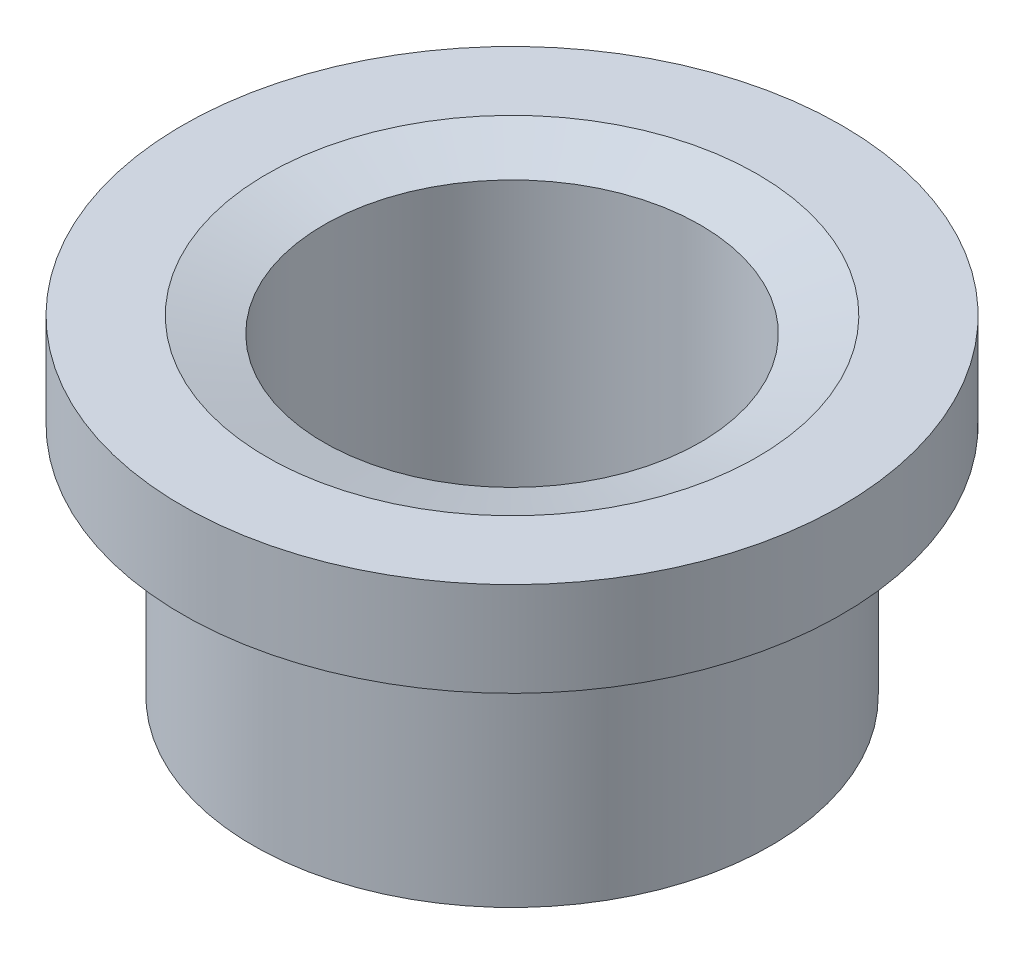
ISO-10303-21;
HEADER;
FILE_DESCRIPTION(('STEP AP214'),'2;1');
FILE_NAME('part.step','',(''),(''),'','','');
FILE_SCHEMA(('AUTOMOTIVE_DESIGN { 1 0 10303 214 1 1 1 1 }'));
ENDSEC;
DATA;
#1=APPLICATION_CONTEXT('core data for automotive mechanical design processes');
#2=APPLICATION_PROTOCOL_DEFINITION('international standard','automotive_design',2000,#1);
#3=PRODUCT_CONTEXT('',#1,'mechanical');
#4=PRODUCT('Part','Part','',(#3));
#5=PRODUCT_RELATED_PRODUCT_CATEGORY('part','',(#4));
#6=PRODUCT_DEFINITION_FORMATION('','',#4);
#7=PRODUCT_DEFINITION_CONTEXT('part definition',#1,'design');
#8=PRODUCT_DEFINITION('design','',#6,#7);
#9=PRODUCT_DEFINITION_SHAPE('','',#8);
#10=(LENGTH_UNIT() NAMED_UNIT(*) SI_UNIT(.MILLI.,.METRE.));
#11=(NAMED_UNIT(*) PLANE_ANGLE_UNIT() SI_UNIT($,.RADIAN.));
#12=(NAMED_UNIT(*) SI_UNIT($,.STERADIAN.) SOLID_ANGLE_UNIT());
#13=UNCERTAINTY_MEASURE_WITH_UNIT(LENGTH_MEASURE(1.E-05),#10,'distance_accuracy_value','');
#14=(GEOMETRIC_REPRESENTATION_CONTEXT(3) GLOBAL_UNCERTAINTY_ASSIGNED_CONTEXT((#13)) GLOBAL_UNIT_ASSIGNED_CONTEXT((#10,
#11,#12)) REPRESENTATION_CONTEXT('',''));
#15=CARTESIAN_POINT('',(0.,0.,0.));
#16=DIRECTION('',(0.,0.,1.));
#17=DIRECTION('',(1.,0.,0.));
#18=AXIS2_PLACEMENT_3D('',#15,#16,#17);
#19=CARTESIAN_POINT('',(0.,0.,0.));
#20=DIRECTION('',(0.,-1.,0.));
#21=DIRECTION('',(0.,0.,-1.));
#22=AXIS2_PLACEMENT_3D('',#19,#20,#21);
#23=CYLINDRICAL_SURFACE('',#22,16.5);
#24=CARTESIAN_POINT('',(0.,15.,0.));
#25=DIRECTION('',(0.,-1.,0.));
#26=DIRECTION('',(0.,0.,-1.));
#27=AXIS2_PLACEMENT_3D('',#24,#25,#26);
#28=CIRCLE('',#27,16.5);
#29=CARTESIAN_POINT('',(0.,15.,-16.5));
#30=VERTEX_POINT('',#29);
#31=EDGE_CURVE('E58',#30,#30,#28,.T.);
#32=ORIENTED_EDGE('',*,*,#31,.T.);
#33=EDGE_LOOP('',(#32));
#34=FACE_BOUND('',#33,.T.);
#35=CARTESIAN_POINT('',(0.,0.,0.));
#36=DIRECTION('',(0.,-1.,0.));
#37=DIRECTION('',(0.,0.,-1.));
#38=AXIS2_PLACEMENT_3D('',#35,#36,#37);
#39=CIRCLE('',#38,16.5);
#40=CARTESIAN_POINT('',(0.,0.,-16.5));
#41=VERTEX_POINT('',#40);
#42=EDGE_CURVE('E10',#41,#41,#39,.T.);
#43=ORIENTED_EDGE('',*,*,#42,.F.);
#44=EDGE_LOOP('',(#43));
#45=FACE_BOUND('',#44,.T.);
#46=ADVANCED_FACE('F33',(#34,#45),#23,.T.);
#47=CARTESIAN_POINT('',(12.,0.,0.));
#48=DIRECTION('',(0.,-1.,0.));
#49=DIRECTION('',(0.,0.,-1.));
#50=AXIS2_PLACEMENT_3D('',#47,#48,#49);
#51=PLANE('',#50);
#52=ORIENTED_EDGE('',*,*,#42,.T.);
#53=EDGE_LOOP('',(#52));
#54=FACE_BOUND('',#53,.T.);
#55=CARTESIAN_POINT('',(0.,0.,0.));
#56=DIRECTION('',(0.,-1.,0.));
#57=DIRECTION('',(0.,0.,-1.));
#58=AXIS2_PLACEMENT_3D('',#55,#56,#57);
#59=CIRCLE('',#58,12.);
#60=CARTESIAN_POINT('',(0.,0.,-12.));
#61=VERTEX_POINT('',#60);
#62=EDGE_CURVE('E39',#61,#61,#59,.T.);
#63=ORIENTED_EDGE('',*,*,#62,.F.);
#64=EDGE_LOOP('',(#63));
#65=FACE_BOUND('',#64,.T.);
#66=ADVANCED_FACE('F76',(#54,#65),#51,.T.);
#67=CARTESIAN_POINT('',(0.,0.,0.));
#68=DIRECTION('',(0.,-1.,0.));
#69=DIRECTION('',(0.,0.,-1.));
#70=AXIS2_PLACEMENT_3D('',#67,#68,#69);
#71=CYLINDRICAL_SURFACE('',#70,12.);
#72=ORIENTED_EDGE('',*,*,#62,.T.);
#73=EDGE_LOOP('',(#72));
#74=FACE_BOUND('',#73,.T.);
#75=CARTESIAN_POINT('',(0.,20.,0.));
#76=DIRECTION('',(0.,-1.,0.));
#77=DIRECTION('',(0.,0.,-1.));
#78=AXIS2_PLACEMENT_3D('',#75,#76,#77);
#79=CIRCLE('',#78,12.);
#80=CARTESIAN_POINT('',(0.,20.,-12.));
#81=VERTEX_POINT('',#80);
#82=EDGE_CURVE('E43',#81,#81,#79,.T.);
#83=ORIENTED_EDGE('',*,*,#82,.F.);
#84=EDGE_LOOP('',(#83));
#85=FACE_BOUND('',#84,.T.);
#86=ADVANCED_FACE('F80',(#74,#85),#71,.F.);
#87=CARTESIAN_POINT('',(0.,21.,0.));
#88=DIRECTION('',(0.,1.,0.));
#89=DIRECTION('',(0.,0.,1.));
#90=AXIS2_PLACEMENT_3D('',#87,#88,#89);
#91=CONICAL_SURFACE('',#90,15.625,1.3016288340092);
#92=ORIENTED_EDGE('',*,*,#82,.T.);
#93=EDGE_LOOP('',(#92));
#94=FACE_BOUND('',#93,.T.);
#95=CARTESIAN_POINT('',(0.,21.,0.));
#96=DIRECTION('',(0.,-1.,0.));
#97=DIRECTION('',(0.,0.,-1.));
#98=AXIS2_PLACEMENT_3D('',#95,#96,#97);
#99=CIRCLE('',#98,15.625);
#100=CARTESIAN_POINT('',(0.,21.,-15.625));
#101=VERTEX_POINT('',#100);
#102=EDGE_CURVE('E47',#101,#101,#99,.T.);
#103=ORIENTED_EDGE('',*,*,#102,.F.);
#104=EDGE_LOOP('',(#103));
#105=FACE_BOUND('',#104,.T.);
#106=ADVANCED_FACE('F84',(#94,#105),#91,.F.);
#107=CARTESIAN_POINT('',(21.,21.,0.));
#108=DIRECTION('',(0.,1.,0.));
#109=DIRECTION('',(0.,0.,1.));
#110=AXIS2_PLACEMENT_3D('',#107,#108,#109);
#111=PLANE('',#110);
#112=ORIENTED_EDGE('',*,*,#102,.T.);
#113=EDGE_LOOP('',(#112));
#114=FACE_BOUND('',#113,.T.);
#115=CARTESIAN_POINT('',(0.,21.,0.));
#116=DIRECTION('',(0.,-1.,0.));
#117=DIRECTION('',(0.,0.,-1.));
#118=AXIS2_PLACEMENT_3D('',#115,#116,#117);
#119=CIRCLE('',#118,21.);
#120=CARTESIAN_POINT('',(0.,21.,-21.));
#121=VERTEX_POINT('',#120);
#122=EDGE_CURVE('E52',#121,#121,#119,.T.);
#123=ORIENTED_EDGE('',*,*,#122,.F.);
#124=EDGE_LOOP('',(#123));
#125=FACE_BOUND('',#124,.T.);
#126=ADVANCED_FACE('F72',(#114,#125),#111,.T.);
#127=CARTESIAN_POINT('',(0.,0.,0.));
#128=DIRECTION('',(0.,-1.,0.));
#129=DIRECTION('',(0.,0.,-1.));
#130=AXIS2_PLACEMENT_3D('',#127,#128,#129);
#131=CYLINDRICAL_SURFACE('',#130,21.);
#132=ORIENTED_EDGE('',*,*,#122,.T.);
#133=EDGE_LOOP('',(#132));
#134=FACE_BOUND('',#133,.T.);
#135=CARTESIAN_POINT('',(0.,15.,0.));
#136=DIRECTION('',(0.,-1.,0.));
#137=DIRECTION('',(0.,0.,-1.));
#138=AXIS2_PLACEMENT_3D('',#135,#136,#137);
#139=CIRCLE('',#138,21.);
#140=CARTESIAN_POINT('',(0.,15.,-21.));
#141=VERTEX_POINT('',#140);
#142=EDGE_CURVE('E55',#141,#141,#139,.T.);
#143=ORIENTED_EDGE('',*,*,#142,.F.);
#144=EDGE_LOOP('',(#143));
#145=FACE_BOUND('',#144,.T.);
#146=ADVANCED_FACE('F66',(#134,#145),#131,.T.);
#147=CARTESIAN_POINT('',(16.5,15.,0.));
#148=DIRECTION('',(0.,-1.,0.));
#149=DIRECTION('',(0.,0.,-1.));
#150=AXIS2_PLACEMENT_3D('',#147,#148,#149);
#151=PLANE('',#150);
#152=ORIENTED_EDGE('',*,*,#142,.T.);
#153=EDGE_LOOP('',(#152));
#154=FACE_BOUND('',#153,.T.);
#155=ORIENTED_EDGE('',*,*,#31,.F.);
#156=EDGE_LOOP('',(#155));
#157=FACE_BOUND('',#156,.T.);
#158=ADVANCED_FACE('F64',(#154,#157),#151,.T.);
#159=CLOSED_SHELL('',(#46,#66,#86,#106,#126,#146,#158));
#160=MANIFOLD_SOLID_BREP('B2',#159);
#161=ADVANCED_BREP_SHAPE_REPRESENTATION('',(#18,#160),#14);
#162=SHAPE_DEFINITION_REPRESENTATION(#9,#161);
ENDSEC;
END-ISO-10303-21;
